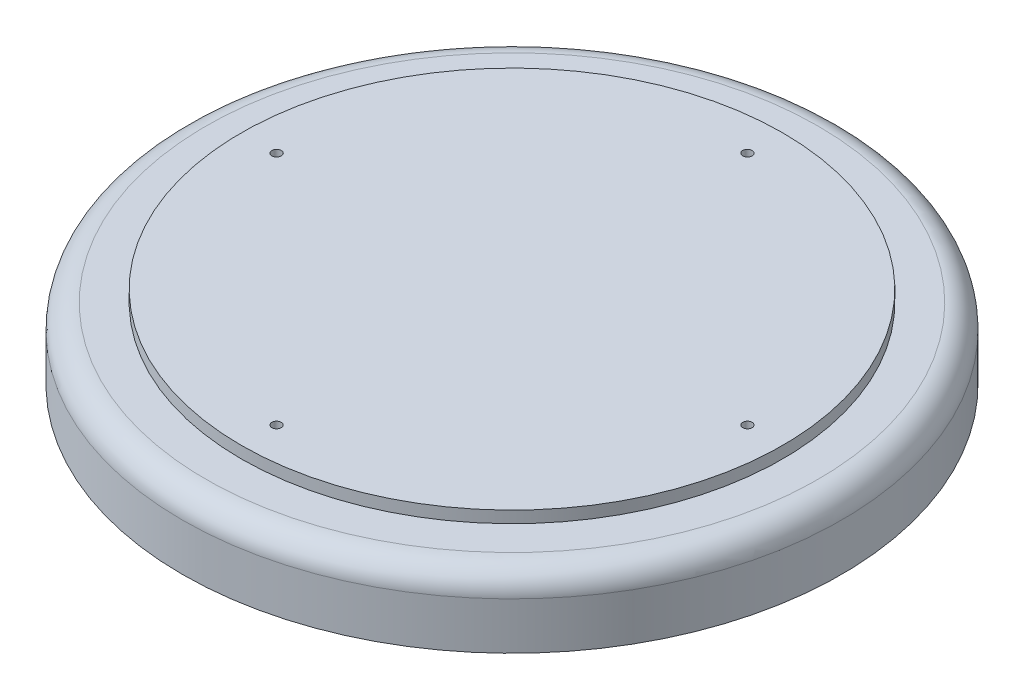
ISO-10303-21;
HEADER;
FILE_DESCRIPTION(('STEP AP214'),'2;1');
FILE_NAME('part.step','',(''),(''),'','','');
FILE_SCHEMA(('AUTOMOTIVE_DESIGN { 1 0 10303 214 1 1 1 1 }'));
ENDSEC;
DATA;
#1=APPLICATION_CONTEXT('core data for automotive mechanical design processes');
#2=APPLICATION_PROTOCOL_DEFINITION('international standard','automotive_design',2000,#1);
#3=PRODUCT_CONTEXT('',#1,'mechanical');
#4=PRODUCT('Part','Part','',(#3));
#5=PRODUCT_RELATED_PRODUCT_CATEGORY('part','',(#4));
#6=PRODUCT_DEFINITION_FORMATION('','',#4);
#7=PRODUCT_DEFINITION_CONTEXT('part definition',#1,'design');
#8=PRODUCT_DEFINITION('design','',#6,#7);
#9=PRODUCT_DEFINITION_SHAPE('','',#8);
#10=(LENGTH_UNIT() NAMED_UNIT(*) SI_UNIT(.MILLI.,.METRE.));
#11=(NAMED_UNIT(*) PLANE_ANGLE_UNIT() SI_UNIT($,.RADIAN.));
#12=(NAMED_UNIT(*) SI_UNIT($,.STERADIAN.) SOLID_ANGLE_UNIT());
#13=UNCERTAINTY_MEASURE_WITH_UNIT(LENGTH_MEASURE(1.E-05),#10,'distance_accuracy_value','');
#14=(GEOMETRIC_REPRESENTATION_CONTEXT(3) GLOBAL_UNCERTAINTY_ASSIGNED_CONTEXT((#13)) GLOBAL_UNIT_ASSIGNED_CONTEXT((#10,
#11,#12)) REPRESENTATION_CONTEXT('',''));
#15=CARTESIAN_POINT('',(0.,0.,0.));
#16=DIRECTION('',(0.,0.,1.));
#17=DIRECTION('',(1.,0.,0.));
#18=AXIS2_PLACEMENT_3D('',#15,#16,#17);
#19=CARTESIAN_POINT('',(0.,6.35,0.));
#20=DIRECTION('',(0.,-1.,0.));
#21=DIRECTION('',(0.,0.,-1.));
#22=AXIS2_PLACEMENT_3D('',#19,#20,#21);
#23=CYLINDRICAL_SURFACE('',#22,146.05);
#24=CARTESIAN_POINT('',(0.,6.35,0.));
#25=DIRECTION('',(0.,1.,0.));
#26=DIRECTION('',(0.,0.,1.));
#27=AXIS2_PLACEMENT_3D('',#24,#25,#26);
#28=CIRCLE('',#27,146.05);
#29=CARTESIAN_POINT('',(0.,6.35,146.05));
#30=VERTEX_POINT('',#29);
#31=EDGE_CURVE('E53',#30,#30,#28,.T.);
#32=ORIENTED_EDGE('',*,*,#31,.F.);
#33=EDGE_LOOP('',(#32));
#34=FACE_BOUND('',#33,.T.);
#35=CARTESIAN_POINT('',(0.,0.,0.));
#36=DIRECTION('',(0.,-1.,0.));
#37=DIRECTION('',(0.,0.,-1.));
#38=AXIS2_PLACEMENT_3D('',#35,#36,#37);
#39=CIRCLE('',#38,146.05);
#40=CARTESIAN_POINT('',(0.,0.,-146.05));
#41=VERTEX_POINT('',#40);
#42=EDGE_CURVE('E56',#41,#41,#39,.T.);
#43=ORIENTED_EDGE('',*,*,#42,.F.);
#44=EDGE_LOOP('',(#43));
#45=FACE_BOUND('',#44,.T.);
#46=ADVANCED_FACE('F33',(#34,#45),#23,.T.);
#47=CARTESIAN_POINT('',(0.,6.35,0.));
#48=DIRECTION('',(0.,1.,0.));
#49=DIRECTION('',(0.,0.,1.));
#50=AXIS2_PLACEMENT_3D('',#47,#48,#49);
#51=PLANE('',#50);
#52=CARTESIAN_POINT('',(127.,6.35,0.));
#53=DIRECTION('',(0.,1.,0.));
#54=DIRECTION('',(0.,0.,1.));
#55=AXIS2_PLACEMENT_3D('',#52,#53,#54);
#56=CIRCLE('',#55,2.54000000000001);
#57=CARTESIAN_POINT('',(127.,6.35,2.54000000000001));
#58=VERTEX_POINT('',#57);
#59=EDGE_CURVE('E82',#58,#58,#56,.T.);
#60=ORIENTED_EDGE('',*,*,#59,.F.);
#61=EDGE_LOOP('',(#60));
#62=FACE_BOUND('',#61,.T.);
#63=CARTESIAN_POINT('',(-127.,6.35,0.));
#64=DIRECTION('',(0.,1.,0.));
#65=DIRECTION('',(0.,0.,1.));
#66=AXIS2_PLACEMENT_3D('',#63,#64,#65);
#67=CIRCLE('',#66,2.54);
#68=CARTESIAN_POINT('',(-127.,6.35,2.54));
#69=VERTEX_POINT('',#68);
#70=EDGE_CURVE('E75',#69,#69,#67,.T.);
#71=ORIENTED_EDGE('',*,*,#70,.F.);
#72=EDGE_LOOP('',(#71));
#73=FACE_BOUND('',#72,.T.);
#74=CARTESIAN_POINT('',(0.,6.35,127.));
#75=DIRECTION('',(0.,1.,0.));
#76=DIRECTION('',(0.,0.,1.));
#77=AXIS2_PLACEMENT_3D('',#74,#75,#76);
#78=CIRCLE('',#77,2.54);
#79=CARTESIAN_POINT('',(0.,6.35,129.54));
#80=VERTEX_POINT('',#79);
#81=EDGE_CURVE('E76',#80,#80,#78,.T.);
#82=ORIENTED_EDGE('',*,*,#81,.F.);
#83=EDGE_LOOP('',(#82));
#84=FACE_BOUND('',#83,.T.);
#85=CARTESIAN_POINT('',(0.,6.35,-127.));
#86=DIRECTION('',(0.,1.,0.));
#87=DIRECTION('',(0.,0.,1.));
#88=AXIS2_PLACEMENT_3D('',#85,#86,#87);
#89=CIRCLE('',#88,2.54);
#90=CARTESIAN_POINT('',(0.,6.35,-124.46));
#91=VERTEX_POINT('',#90);
#92=EDGE_CURVE('E68',#91,#91,#89,.T.);
#93=ORIENTED_EDGE('',*,*,#92,.F.);
#94=EDGE_LOOP('',(#93));
#95=FACE_BOUND('',#94,.T.);
#96=ORIENTED_EDGE('',*,*,#31,.T.);
#97=EDGE_LOOP('',(#96));
#98=FACE_BOUND('',#97,.T.);
#99=ADVANCED_FACE('F93',(#62,#73,#84,#95,#98),#51,.T.);
#100=CARTESIAN_POINT('',(0.,-38.1,0.));
#101=DIRECTION('',(0.,1.,0.));
#102=DIRECTION('',(0.,0.,1.));
#103=AXIS2_PLACEMENT_3D('',#100,#101,#102);
#104=CYLINDRICAL_SURFACE('',#103,177.8);
#105=CARTESIAN_POINT('',(0.,-12.7,0.));
#106=DIRECTION('',(0.,-1.,0.));
#107=DIRECTION('',(0.,0.,-1.));
#108=AXIS2_PLACEMENT_3D('',#105,#106,#107);
#109=CIRCLE('',#108,177.8);
#110=CARTESIAN_POINT('',(0.,-12.7,177.8));
#111=VERTEX_POINT('',#110);
#112=EDGE_CURVE('E40',#111,#111,#109,.T.);
#113=CARTESIAN_POINT('',(0.,-38.1,0.));
#114=DIRECTION('',(0.,-1.,0.));
#115=DIRECTION('',(0.,0.,-1.));
#116=AXIS2_PLACEMENT_3D('',#113,#114,#115);
#117=CIRCLE('',#116,177.8);
#118=CARTESIAN_POINT('',(0.,-38.1,177.8));
#119=VERTEX_POINT('',#118);
#120=EDGE_CURVE('E59',#119,#119,#117,.T.);
#121=CARTESIAN_POINT('',(0.,-12.7,177.8));
#122=CARTESIAN_POINT('',(0.,-12.9645833333333,177.8));
#123=CARTESIAN_POINT('',(0.,-13.2291666666667,177.8));
#124=CARTESIAN_POINT('',(0.,-13.7583333333333,177.8));
#125=CARTESIAN_POINT('',(0.,-14.0229166666667,177.8));
#126=CARTESIAN_POINT('',(0.,-14.5520833333333,177.8));
#127=CARTESIAN_POINT('',(0.,-14.8166666666667,177.8));
#128=CARTESIAN_POINT('',(0.,-15.3458333333333,177.8));
#129=CARTESIAN_POINT('',(0.,-15.6104166666667,177.8));
#130=CARTESIAN_POINT('',(0.,-16.1395833333333,177.8));
#131=CARTESIAN_POINT('',(0.,-16.4041666666667,177.8));
#132=CARTESIAN_POINT('',(0.,-16.9333333333333,177.8));
#133=CARTESIAN_POINT('',(0.,-17.1979166666667,177.8));
#134=CARTESIAN_POINT('',(0.,-17.7270833333333,177.8));
#135=CARTESIAN_POINT('',(0.,-17.9916666666667,177.8));
#136=CARTESIAN_POINT('',(0.,-18.5208333333333,177.8));
#137=CARTESIAN_POINT('',(0.,-18.7854166666667,177.8));
#138=CARTESIAN_POINT('',(0.,-19.3145833333333,177.8));
#139=CARTESIAN_POINT('',(0.,-19.5791666666667,177.8));
#140=CARTESIAN_POINT('',(0.,-20.1083333333333,177.8));
#141=CARTESIAN_POINT('',(0.,-20.3729166666667,177.8));
#142=CARTESIAN_POINT('',(0.,-20.9020833333333,177.8));
#143=CARTESIAN_POINT('',(0.,-21.1666666666667,177.8));
#144=CARTESIAN_POINT('',(0.,-21.6958333333333,177.8));
#145=CARTESIAN_POINT('',(0.,-21.9604166666667,177.8));
#146=CARTESIAN_POINT('',(0.,-22.4895833333333,177.8));
#147=CARTESIAN_POINT('',(0.,-22.7541666666667,177.8));
#148=CARTESIAN_POINT('',(0.,-23.2833333333333,177.8));
#149=CARTESIAN_POINT('',(0.,-23.5479166666667,177.8));
#150=CARTESIAN_POINT('',(0.,-24.0770833333333,177.8));
#151=CARTESIAN_POINT('',(0.,-24.3416666666667,177.8));
#152=CARTESIAN_POINT('',(0.,-24.8708333333333,177.8));
#153=CARTESIAN_POINT('',(0.,-25.1354166666667,177.8));
#154=CARTESIAN_POINT('',(0.,-25.6645833333333,177.8));
#155=CARTESIAN_POINT('',(0.,-25.9291666666667,177.8));
#156=CARTESIAN_POINT('',(0.,-26.4583333333333,177.8));
#157=CARTESIAN_POINT('',(0.,-26.7229166666667,177.8));
#158=CARTESIAN_POINT('',(0.,-27.2520833333333,177.8));
#159=CARTESIAN_POINT('',(0.,-27.5166666666667,177.8));
#160=CARTESIAN_POINT('',(0.,-28.0458333333333,177.8));
#161=CARTESIAN_POINT('',(0.,-28.3104166666667,177.8));
#162=CARTESIAN_POINT('',(0.,-28.8395833333333,177.8));
#163=CARTESIAN_POINT('',(0.,-29.1041666666667,177.8));
#164=CARTESIAN_POINT('',(0.,-29.6333333333333,177.8));
#165=CARTESIAN_POINT('',(0.,-29.8979166666667,177.8));
#166=CARTESIAN_POINT('',(0.,-30.4270833333333,177.8));
#167=CARTESIAN_POINT('',(0.,-30.6916666666667,177.8));
#168=CARTESIAN_POINT('',(0.,-31.2208333333333,177.8));
#169=CARTESIAN_POINT('',(0.,-31.4854166666667,177.8));
#170=CARTESIAN_POINT('',(0.,-32.0145833333333,177.8));
#171=CARTESIAN_POINT('',(0.,-32.2791666666667,177.8));
#172=CARTESIAN_POINT('',(0.,-32.8083333333333,177.8));
#173=CARTESIAN_POINT('',(0.,-33.0729166666667,177.8));
#174=CARTESIAN_POINT('',(0.,-33.6020833333333,177.8));
#175=CARTESIAN_POINT('',(0.,-33.8666666666667,177.8));
#176=CARTESIAN_POINT('',(0.,-34.3958333333333,177.8));
#177=CARTESIAN_POINT('',(0.,-34.6604166666667,177.8));
#178=CARTESIAN_POINT('',(0.,-35.1895833333333,177.8));
#179=CARTESIAN_POINT('',(0.,-35.4541666666667,177.8));
#180=CARTESIAN_POINT('',(0.,-35.9833333333333,177.8));
#181=CARTESIAN_POINT('',(0.,-36.2479166666667,177.8));
#182=CARTESIAN_POINT('',(0.,-36.7770833333333,177.8));
#183=CARTESIAN_POINT('',(0.,-37.0416666666667,177.8));
#184=CARTESIAN_POINT('',(0.,-37.5708333333333,177.8));
#185=CARTESIAN_POINT('',(0.,-37.8354166666667,177.8));
#186=CARTESIAN_POINT('',(0.,-38.1,177.8));
#187=B_SPLINE_CURVE_WITH_KNOTS('',3,(#121,#122,#123,#124,#125,#126,#127,#128,#129,#130,#131,
#132,#133,#134,#135,#136,#137,#138,#139,#140,#141,#142,#143,#144,#145,#146,#147,#148,#149,#150,
#151,#152,#153,#154,#155,#156,#157,#158,#159,#160,#161,#162,#163,#164,#165,#166,#167,#168,#169,
#170,#171,#172,#173,#174,#175,#176,#177,#178,#179,#180,#181,#182,#183,#184,#185,#186),
.UNSPECIFIED.,.F.,.F.,(4,2,2,2,2,2,2,2,2,2,2,2,2,2,2,2,2,2,2,2,2,2,2,2,2,2,2,2,2,2,2,2,4),(0.,
0.793749999999999,1.5875,2.38125,3.175,3.96875,4.7625,5.55625,6.35,7.14375,7.9375,8.73125,9.525,
10.31875,11.1125,11.90625,12.7,13.49375,14.2875,15.08125,15.875,16.66875,17.4625,18.25625,19.05,
19.84375,20.6375,21.43125,22.225,23.01875,23.8125,24.60625,25.4),.UNSPECIFIED.);
#188=EDGE_CURVE('BSEAM96',#111,#119,#187,.T.);
#189=ORIENTED_EDGE('',*,*,#112,.T.);
#190=ORIENTED_EDGE('',*,*,#120,.F.);
#191=ORIENTED_EDGE('',*,*,#188,.T.);
#192=ORIENTED_EDGE('',*,*,#188,.F.);
#193=EDGE_LOOP('',(#189,#191,#190,#192));
#194=FACE_BOUND('',#193,.T.);
#195=ADVANCED_FACE('F96',(#194),#104,.T.);
#196=CARTESIAN_POINT('',(0.,-38.1,0.));
#197=DIRECTION('',(0.,-1.,0.));
#198=DIRECTION('',(0.,0.,-1.));
#199=AXIS2_PLACEMENT_3D('',#196,#197,#198);
#200=PLANE('',#199);
#201=CARTESIAN_POINT('',(0.,-38.1,0.));
#202=DIRECTION('',(0.,-1.,0.));
#203=DIRECTION('',(0.,0.,-1.));
#204=AXIS2_PLACEMENT_3D('',#201,#202,#203);
#205=CIRCLE('',#204,174.625);
#206=CARTESIAN_POINT('',(0.,-38.1,-174.625));
#207=VERTEX_POINT('',#206);
#208=EDGE_CURVE('E62',#207,#207,#205,.T.);
#209=ORIENTED_EDGE('',*,*,#208,.F.);
#210=EDGE_LOOP('',(#209));
#211=FACE_BOUND('',#210,.T.);
#212=ORIENTED_EDGE('',*,*,#120,.T.);
#213=EDGE_LOOP('',(#212));
#214=FACE_BOUND('',#213,.T.);
#215=ADVANCED_FACE('F114',(#211,#214),#200,.T.);
#216=CARTESIAN_POINT('',(0.,0.,0.));
#217=DIRECTION('',(0.,-1.,0.));
#218=DIRECTION('',(0.,0.,-1.));
#219=AXIS2_PLACEMENT_3D('',#216,#217,#218);
#220=PLANE('',#219);
#221=CARTESIAN_POINT('',(0.,0.,0.));
#222=DIRECTION('',(0.,-1.,0.));
#223=DIRECTION('',(0.,0.,-1.));
#224=AXIS2_PLACEMENT_3D('',#221,#222,#223);
#225=CIRCLE('',#224,165.1);
#226=CARTESIAN_POINT('',(0.,0.,-165.1));
#227=VERTEX_POINT('',#226);
#228=EDGE_CURVE('E11',#227,#227,#225,.F.);
#229=ORIENTED_EDGE('',*,*,#228,.T.);
#230=EDGE_LOOP('',(#229));
#231=FACE_BOUND('',#230,.T.);
#232=ORIENTED_EDGE('',*,*,#42,.T.);
#233=EDGE_LOOP('',(#232));
#234=FACE_BOUND('',#233,.T.);
#235=ADVANCED_FACE('F111',(#231,#234),#220,.F.);
#236=CARTESIAN_POINT('',(0.,493.914086658803,0.));
#237=DIRECTION('',(0.,-1.,0.));
#238=DIRECTION('',(0.,0.,-1.));
#239=AXIS2_PLACEMENT_3D('',#236,#237,#238);
#240=CYLINDRICAL_SURFACE('',#239,174.625);
#241=CARTESIAN_POINT('',(0.,-15.875,0.));
#242=DIRECTION('',(0.,-1.,0.));
#243=DIRECTION('',(0.,0.,-1.));
#244=AXIS2_PLACEMENT_3D('',#241,#242,#243);
#245=CIRCLE('',#244,174.625);
#246=CARTESIAN_POINT('',(0.,-15.875,-174.625));
#247=VERTEX_POINT('',#246);
#248=EDGE_CURVE('E48',#247,#247,#245,.F.);
#249=ORIENTED_EDGE('',*,*,#248,.T.);
#250=EDGE_LOOP('',(#249));
#251=FACE_BOUND('',#250,.T.);
#252=ORIENTED_EDGE('',*,*,#208,.T.);
#253=EDGE_LOOP('',(#252));
#254=FACE_BOUND('',#253,.T.);
#255=ADVANCED_FACE('F113',(#251,#254),#240,.F.);
#256=CARTESIAN_POINT('',(0.,-3.175,0.));
#257=DIRECTION('',(0.,-1.,0.));
#258=DIRECTION('',(0.,0.,-1.));
#259=AXIS2_PLACEMENT_3D('',#256,#257,#258);
#260=PLANE('',#259);
#261=CARTESIAN_POINT('',(127.,-3.175,0.));
#262=DIRECTION('',(0.,-1.,0.));
#263=DIRECTION('',(0.,0.,-1.));
#264=AXIS2_PLACEMENT_3D('',#261,#262,#263);
#265=CIRCLE('',#264,2.54000000000001);
#266=CARTESIAN_POINT('',(127.,-3.175,-2.54000000000001));
#267=VERTEX_POINT('',#266);
#268=EDGE_CURVE('E71',#267,#267,#265,.F.);
#269=ORIENTED_EDGE('',*,*,#268,.T.);
#270=EDGE_LOOP('',(#269));
#271=FACE_BOUND('',#270,.T.);
#272=CARTESIAN_POINT('',(-127.,-3.175,0.));
#273=DIRECTION('',(0.,-1.,0.));
#274=DIRECTION('',(0.,0.,-1.));
#275=AXIS2_PLACEMENT_3D('',#272,#273,#274);
#276=CIRCLE('',#275,2.54);
#277=CARTESIAN_POINT('',(-127.,-3.175,-2.54));
#278=VERTEX_POINT('',#277);
#279=EDGE_CURVE('E79',#278,#278,#276,.F.);
#280=ORIENTED_EDGE('',*,*,#279,.T.);
#281=EDGE_LOOP('',(#280));
#282=FACE_BOUND('',#281,.T.);
#283=CARTESIAN_POINT('',(0.,-3.175,127.));
#284=DIRECTION('',(0.,-1.,0.));
#285=DIRECTION('',(0.,0.,-1.));
#286=AXIS2_PLACEMENT_3D('',#283,#284,#285);
#287=CIRCLE('',#286,2.54);
#288=CARTESIAN_POINT('',(0.,-3.175,124.46));
#289=VERTEX_POINT('',#288);
#290=EDGE_CURVE('E72',#289,#289,#287,.F.);
#291=ORIENTED_EDGE('',*,*,#290,.T.);
#292=EDGE_LOOP('',(#291));
#293=FACE_BOUND('',#292,.T.);
#294=CARTESIAN_POINT('',(0.,-3.175,-127.));
#295=DIRECTION('',(0.,-1.,0.));
#296=DIRECTION('',(0.,0.,-1.));
#297=AXIS2_PLACEMENT_3D('',#294,#295,#296);
#298=CIRCLE('',#297,2.54);
#299=CARTESIAN_POINT('',(0.,-3.175,-129.54));
#300=VERTEX_POINT('',#299);
#301=EDGE_CURVE('E65',#300,#300,#298,.F.);
#302=ORIENTED_EDGE('',*,*,#301,.T.);
#303=EDGE_LOOP('',(#302));
#304=FACE_BOUND('',#303,.T.);
#305=CARTESIAN_POINT('',(0.,-3.175,0.));
#306=DIRECTION('',(0.,-1.,0.));
#307=DIRECTION('',(0.,0.,-1.));
#308=AXIS2_PLACEMENT_3D('',#305,#306,#307);
#309=CIRCLE('',#308,161.925);
#310=CARTESIAN_POINT('',(0.,-3.175,-161.925));
#311=VERTEX_POINT('',#310);
#312=EDGE_CURVE('E44',#311,#311,#309,.T.);
#313=ORIENTED_EDGE('',*,*,#312,.T.);
#314=EDGE_LOOP('',(#313));
#315=FACE_BOUND('',#314,.T.);
#316=ADVANCED_FACE('F120',(#271,#282,#293,#304,#315),#260,.T.);
#317=CARTESIAN_POINT('',(0.,-15.875,0.));
#318=DIRECTION('',(0.,-1.,0.));
#319=DIRECTION('',(0.,0.,-1.));
#320=AXIS2_PLACEMENT_3D('',#317,#318,#319);
#321=TOROIDAL_SURFACE('',#320,161.925,12.7);
#322=ORIENTED_EDGE('',*,*,#312,.F.);
#323=EDGE_LOOP('',(#322));
#324=FACE_BOUND('',#323,.T.);
#325=ORIENTED_EDGE('',*,*,#248,.F.);
#326=EDGE_LOOP('',(#325));
#327=FACE_BOUND('',#326,.T.);
#328=ADVANCED_FACE('F127',(#324,#327),#321,.F.);
#329=CARTESIAN_POINT('',(0.,-12.7,0.));
#330=DIRECTION('',(0.,-1.,0.));
#331=DIRECTION('',(0.,0.,-1.));
#332=AXIS2_PLACEMENT_3D('',#329,#330,#331);
#333=TOROIDAL_SURFACE('',#332,165.1,12.7);
#334=ORIENTED_EDGE('',*,*,#228,.F.);
#335=EDGE_LOOP('',(#334));
#336=FACE_BOUND('',#335,.T.);
#337=ORIENTED_EDGE('',*,*,#112,.F.);
#338=EDGE_LOOP('',(#337));
#339=FACE_BOUND('',#338,.T.);
#340=ADVANCED_FACE('F35',(#336,#339),#333,.T.);
#341=CARTESIAN_POINT('',(0.,-10.3592048968554,-127.));
#342=DIRECTION('',(0.,1.,0.));
#343=DIRECTION('',(0.,0.,1.));
#344=AXIS2_PLACEMENT_3D('',#341,#342,#343);
#345=CYLINDRICAL_SURFACE('',#344,2.54);
#346=ORIENTED_EDGE('',*,*,#92,.T.);
#347=EDGE_LOOP('',(#346));
#348=FACE_BOUND('',#347,.T.);
#349=ORIENTED_EDGE('',*,*,#301,.F.);
#350=EDGE_LOOP('',(#349));
#351=FACE_BOUND('',#350,.T.);
#352=ADVANCED_FACE('F134',(#348,#351),#345,.F.);
#353=CARTESIAN_POINT('',(0.,-10.3592048968554,127.));
#354=DIRECTION('',(0.,1.,0.));
#355=DIRECTION('',(0.,0.,1.));
#356=AXIS2_PLACEMENT_3D('',#353,#354,#355);
#357=CYLINDRICAL_SURFACE('',#356,2.54);
#358=ORIENTED_EDGE('',*,*,#81,.T.);
#359=EDGE_LOOP('',(#358));
#360=FACE_BOUND('',#359,.T.);
#361=ORIENTED_EDGE('',*,*,#290,.F.);
#362=EDGE_LOOP('',(#361));
#363=FACE_BOUND('',#362,.T.);
#364=ADVANCED_FACE('F153',(#360,#363),#357,.F.);
#365=CARTESIAN_POINT('',(-127.,-10.3592048968554,0.));
#366=DIRECTION('',(0.,1.,0.));
#367=DIRECTION('',(0.,0.,1.));
#368=AXIS2_PLACEMENT_3D('',#365,#366,#367);
#369=CYLINDRICAL_SURFACE('',#368,2.54);
#370=ORIENTED_EDGE('',*,*,#70,.T.);
#371=EDGE_LOOP('',(#370));
#372=FACE_BOUND('',#371,.T.);
#373=ORIENTED_EDGE('',*,*,#279,.F.);
#374=EDGE_LOOP('',(#373));
#375=FACE_BOUND('',#374,.T.);
#376=ADVANCED_FACE('F157',(#372,#375),#369,.F.);
#377=CARTESIAN_POINT('',(127.,-10.3592048968554,0.));
#378=DIRECTION('',(0.,1.,0.));
#379=DIRECTION('',(0.,0.,1.));
#380=AXIS2_PLACEMENT_3D('',#377,#378,#379);
#381=CYLINDRICAL_SURFACE('',#380,2.54000000000001);
#382=ORIENTED_EDGE('',*,*,#59,.T.);
#383=EDGE_LOOP('',(#382));
#384=FACE_BOUND('',#383,.T.);
#385=ORIENTED_EDGE('',*,*,#268,.F.);
#386=EDGE_LOOP('',(#385));
#387=FACE_BOUND('',#386,.T.);
#388=ADVANCED_FACE('F90',(#384,#387),#381,.F.);
#389=CLOSED_SHELL('',(#46,#99,#195,#215,#235,#255,#316,#328,#340,#352,#364,#376,#388));
#390=MANIFOLD_SOLID_BREP('B2',#389);
#391=ADVANCED_BREP_SHAPE_REPRESENTATION('',(#18,#390),#14);
#392=SHAPE_DEFINITION_REPRESENTATION(#9,#391);
ENDSEC;
END-ISO-10303-21;
